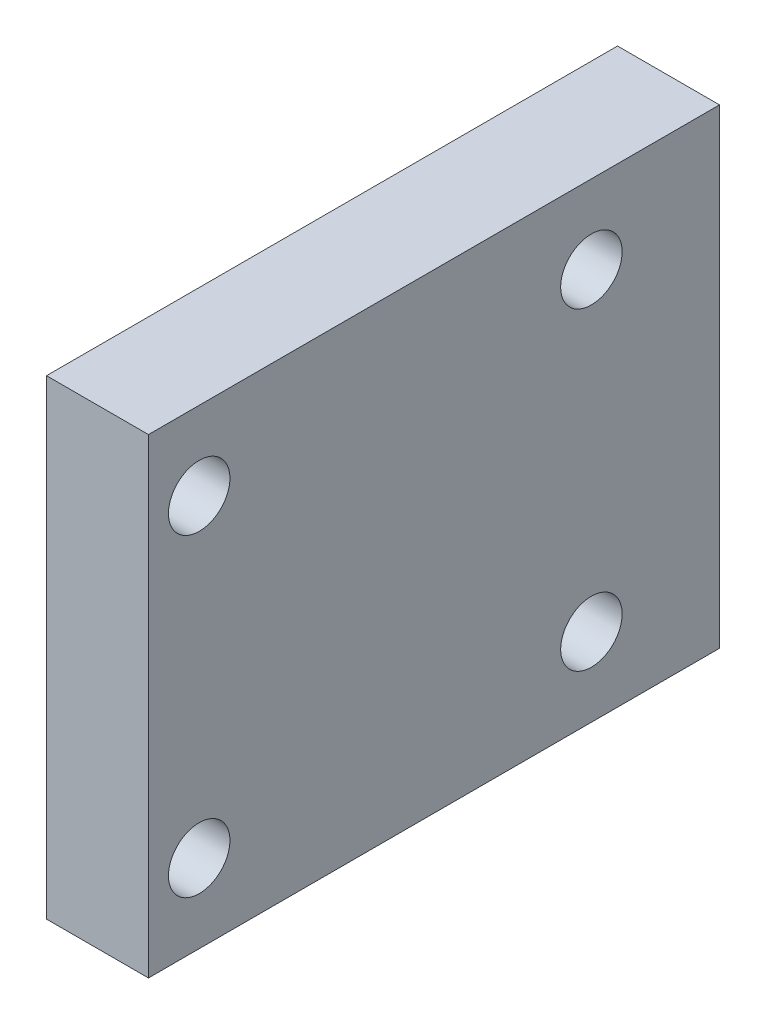
ISO-10303-21;
HEADER;
FILE_DESCRIPTION(('STEP AP214'),'2;1');
FILE_NAME('part.step','',(''),(''),'','','');
FILE_SCHEMA(('AUTOMOTIVE_DESIGN { 1 0 10303 214 1 1 1 1 }'));
ENDSEC;
DATA;
#1=APPLICATION_CONTEXT('core data for automotive mechanical design processes');
#2=APPLICATION_PROTOCOL_DEFINITION('international standard','automotive_design',2000,#1);
#3=PRODUCT_CONTEXT('',#1,'mechanical');
#4=PRODUCT('Part','Part','',(#3));
#5=PRODUCT_RELATED_PRODUCT_CATEGORY('part','',(#4));
#6=PRODUCT_DEFINITION_FORMATION('','',#4);
#7=PRODUCT_DEFINITION_CONTEXT('part definition',#1,'design');
#8=PRODUCT_DEFINITION('design','',#6,#7);
#9=PRODUCT_DEFINITION_SHAPE('','',#8);
#10=(LENGTH_UNIT() NAMED_UNIT(*) SI_UNIT(.MILLI.,.METRE.));
#11=(NAMED_UNIT(*) PLANE_ANGLE_UNIT() SI_UNIT($,.RADIAN.));
#12=(NAMED_UNIT(*) SI_UNIT($,.STERADIAN.) SOLID_ANGLE_UNIT());
#13=UNCERTAINTY_MEASURE_WITH_UNIT(LENGTH_MEASURE(1.E-05),#10,'distance_accuracy_value','');
#14=(GEOMETRIC_REPRESENTATION_CONTEXT(3) GLOBAL_UNCERTAINTY_ASSIGNED_CONTEXT((#13)) GLOBAL_UNIT_ASSIGNED_CONTEXT((#10,
#11,#12)) REPRESENTATION_CONTEXT('',''));
#15=CARTESIAN_POINT('',(0.,0.,0.));
#16=DIRECTION('',(0.,0.,1.));
#17=DIRECTION('',(1.,0.,0.));
#18=AXIS2_PLACEMENT_3D('',#15,#16,#17);
#19=CARTESIAN_POINT('',(-480.710433296048,166.583779805462,-148.759330938672));
#20=DIRECTION('',(0.,0.,-1.));
#21=DIRECTION('',(-1.,0.,0.));
#22=AXIS2_PLACEMENT_3D('',#19,#20,#21);
#23=PLANE('',#22);
#24=DIRECTION('',(0.,-1.,0.));
#25=VECTOR('',#24,1.);
#26=CARTESIAN_POINT('',(-488.965433296048,166.583779805462,-148.759330938672));
#27=LINE('',#26,#25);
#28=CARTESIAN_POINT('',(-488.965433296048,166.583779805462,-148.759330938672));
#29=VERTEX_POINT('',#28);
#30=CARTESIAN_POINT('',(-488.965433296047,128.483779805462,-148.759330938672));
#31=VERTEX_POINT('',#30);
#32=EDGE_CURVE('E102',#29,#31,#27,.T.);
#33=ORIENTED_EDGE('',*,*,#32,.T.);
#34=DIRECTION('',(-1.,0.,0.));
#35=VECTOR('',#34,1.);
#36=CARTESIAN_POINT('',(-480.710433296047,128.483779805462,-148.759330938672));
#37=LINE('',#36,#35);
#38=CARTESIAN_POINT('',(-480.710433296047,128.483779805462,-148.759330938672));
#39=VERTEX_POINT('',#38);
#40=EDGE_CURVE('E11',#39,#31,#37,.T.);
#41=ORIENTED_EDGE('',*,*,#40,.F.);
#42=DIRECTION('',(0.,-1.,0.));
#43=VECTOR('',#42,1.);
#44=CARTESIAN_POINT('',(-480.710433296048,166.583779805462,-148.759330938672));
#45=LINE('',#44,#43);
#46=CARTESIAN_POINT('',(-480.710433296048,166.583779805462,-148.759330938672));
#47=VERTEX_POINT('',#46);
#48=EDGE_CURVE('E89',#47,#39,#45,.T.);
#49=ORIENTED_EDGE('',*,*,#48,.F.);
#50=DIRECTION('',(-1.,0.,0.));
#51=VECTOR('',#50,1.);
#52=CARTESIAN_POINT('',(-480.710433296048,166.583779805462,-148.759330938672));
#53=LINE('',#52,#51);
#54=EDGE_CURVE('E98',#47,#29,#53,.T.);
#55=ORIENTED_EDGE('',*,*,#54,.T.);
#56=EDGE_LOOP('',(#33,#41,#49,#55));
#57=FACE_BOUND('',#56,.T.);
#58=ADVANCED_FACE('F37',(#57),#23,.F.);
#59=CARTESIAN_POINT('',(-480.710433296047,128.483779805462,-194.987330938672));
#60=DIRECTION('',(0.,1.,0.));
#61=DIRECTION('',(-1.,0.,0.));
#62=AXIS2_PLACEMENT_3D('',#59,#60,#61);
#63=PLANE('',#62);
#64=DIRECTION('',(0.,0.,-1.));
#65=VECTOR('',#64,1.);
#66=CARTESIAN_POINT('',(-488.965433296047,128.483779805462,-194.987330938672));
#67=LINE('',#66,#65);
#68=CARTESIAN_POINT('',(-488.965433296047,128.483779805462,-194.987330938672));
#69=VERTEX_POINT('',#68);
#70=EDGE_CURVE('E93',#31,#69,#67,.T.);
#71=ORIENTED_EDGE('',*,*,#70,.T.);
#72=DIRECTION('',(-1.,0.,0.));
#73=VECTOR('',#72,1.);
#74=CARTESIAN_POINT('',(-480.710433296047,128.483779805462,-194.987330938672));
#75=LINE('',#74,#73);
#76=CARTESIAN_POINT('',(-480.710433296047,128.483779805462,-194.987330938672));
#77=VERTEX_POINT('',#76);
#78=EDGE_CURVE('E46',#77,#69,#75,.T.);
#79=ORIENTED_EDGE('',*,*,#78,.F.);
#80=DIRECTION('',(0.,0.,-1.));
#81=VECTOR('',#80,1.);
#82=CARTESIAN_POINT('',(-480.710433296047,128.483779805462,-194.987330938672));
#83=LINE('',#82,#81);
#84=EDGE_CURVE('E84',#39,#77,#83,.T.);
#85=ORIENTED_EDGE('',*,*,#84,.F.);
#86=ORIENTED_EDGE('',*,*,#40,.T.);
#87=EDGE_LOOP('',(#71,#79,#85,#86));
#88=FACE_BOUND('',#87,.T.);
#89=ADVANCED_FACE('F92',(#88),#63,.F.);
#90=CARTESIAN_POINT('',(-480.710433296047,128.483779805462,-194.987330938672));
#91=DIRECTION('',(0.,0.,1.));
#92=DIRECTION('',(1.,0.,0.));
#93=AXIS2_PLACEMENT_3D('',#90,#91,#92);
#94=PLANE('',#93);
#95=DIRECTION('',(0.,1.,0.));
#96=VECTOR('',#95,1.);
#97=CARTESIAN_POINT('',(-488.965433296047,128.483779805462,-194.987330938672));
#98=LINE('',#97,#96);
#99=CARTESIAN_POINT('',(-488.965433296048,166.583779805462,-194.987330938672));
#100=VERTEX_POINT('',#99);
#101=EDGE_CURVE('E71',#69,#100,#98,.T.);
#102=ORIENTED_EDGE('',*,*,#101,.T.);
#103=DIRECTION('',(-1.,0.,0.));
#104=VECTOR('',#103,1.);
#105=CARTESIAN_POINT('',(-480.710433296048,166.583779805462,-194.987330938672));
#106=LINE('',#105,#104);
#107=CARTESIAN_POINT('',(-480.710433296048,166.583779805462,-194.987330938672));
#108=VERTEX_POINT('',#107);
#109=EDGE_CURVE('E94',#108,#100,#106,.T.);
#110=ORIENTED_EDGE('',*,*,#109,.F.);
#111=DIRECTION('',(0.,1.,0.));
#112=VECTOR('',#111,1.);
#113=CARTESIAN_POINT('',(-480.710433296047,128.483779805462,-194.987330938672));
#114=LINE('',#113,#112);
#115=EDGE_CURVE('E87',#77,#108,#114,.T.);
#116=ORIENTED_EDGE('',*,*,#115,.F.);
#117=ORIENTED_EDGE('',*,*,#78,.T.);
#118=EDGE_LOOP('',(#102,#110,#116,#117));
#119=FACE_BOUND('',#118,.T.);
#120=ADVANCED_FACE('F96',(#119),#94,.F.);
#121=CARTESIAN_POINT('',(-480.710433296048,166.583779805462,-194.987330938672));
#122=DIRECTION('',(0.,-1.,0.));
#123=DIRECTION('',(1.,0.,0.));
#124=AXIS2_PLACEMENT_3D('',#121,#122,#123);
#125=PLANE('',#124);
#126=DIRECTION('',(0.,0.,1.));
#127=VECTOR('',#126,1.);
#128=CARTESIAN_POINT('',(-488.965433296048,166.583779805462,-194.987330938672));
#129=LINE('',#128,#127);
#130=EDGE_CURVE('E77',#100,#29,#129,.T.);
#131=ORIENTED_EDGE('',*,*,#130,.T.);
#132=ORIENTED_EDGE('',*,*,#54,.F.);
#133=DIRECTION('',(0.,0.,1.));
#134=VECTOR('',#133,1.);
#135=CARTESIAN_POINT('',(-480.710433296048,166.583779805462,-194.987330938672));
#136=LINE('',#135,#134);
#137=EDGE_CURVE('E54',#108,#47,#136,.T.);
#138=ORIENTED_EDGE('',*,*,#137,.F.);
#139=ORIENTED_EDGE('',*,*,#109,.T.);
#140=EDGE_LOOP('',(#131,#132,#138,#139));
#141=FACE_BOUND('',#140,.T.);
#142=ADVANCED_FACE('F110',(#141),#125,.F.);
#143=CARTESIAN_POINT('',(-480.710433296046,-5.61234270432883E-12,0.));
#144=DIRECTION('',(-1.,0.,0.));
#145=DIRECTION('',(0.,-1.,0.));
#146=AXIS2_PLACEMENT_3D('',#143,#144,#145);
#147=PLANE('',#146);
#148=CARTESIAN_POINT('',(-480.710433296048,160.233779805462,-184.616110940737));
#149=DIRECTION('',(-1.,0.,0.));
#150=DIRECTION('',(0.,-1.,0.));
#151=AXIS2_PLACEMENT_3D('',#148,#149,#150);
#152=CIRCLE('',#151,2.4892);
#153=CARTESIAN_POINT('',(-480.710433296048,157.744579805462,-184.616110940737));
#154=VERTEX_POINT('',#153);
#155=EDGE_CURVE('E40',#154,#154,#152,.T.);
#156=ORIENTED_EDGE('',*,*,#155,.T.);
#157=EDGE_LOOP('',(#156));
#158=FACE_BOUND('',#157,.T.);
#159=CARTESIAN_POINT('',(-480.710433296048,160.233779805462,-152.866110940737));
#160=DIRECTION('',(-1.,0.,0.));
#161=DIRECTION('',(0.,-1.,0.));
#162=AXIS2_PLACEMENT_3D('',#159,#160,#161);
#163=CIRCLE('',#162,2.4892);
#164=CARTESIAN_POINT('',(-480.710433296048,157.744579805462,-152.866110940737));
#165=VERTEX_POINT('',#164);
#166=EDGE_CURVE('E127',#165,#165,#163,.T.);
#167=ORIENTED_EDGE('',*,*,#166,.T.);
#168=EDGE_LOOP('',(#167));
#169=FACE_BOUND('',#168,.T.);
#170=CARTESIAN_POINT('',(-480.710433296048,134.833779805462,-152.866110940737));
#171=DIRECTION('',(-1.,0.,0.));
#172=DIRECTION('',(0.,-1.,0.));
#173=AXIS2_PLACEMENT_3D('',#170,#171,#172);
#174=CIRCLE('',#173,2.4892);
#175=CARTESIAN_POINT('',(-480.710433296047,132.344579805462,-152.866110940737));
#176=VERTEX_POINT('',#175);
#177=EDGE_CURVE('E121',#176,#176,#174,.T.);
#178=ORIENTED_EDGE('',*,*,#177,.T.);
#179=EDGE_LOOP('',(#178));
#180=FACE_BOUND('',#179,.T.);
#181=CARTESIAN_POINT('',(-480.710433296048,134.833779805462,-184.616110940737));
#182=DIRECTION('',(-1.,0.,0.));
#183=DIRECTION('',(0.,-1.,0.));
#184=AXIS2_PLACEMENT_3D('',#181,#182,#183);
#185=CIRCLE('',#184,2.4892);
#186=CARTESIAN_POINT('',(-480.710433296047,132.344579805462,-184.616110940737));
#187=VERTEX_POINT('',#186);
#188=EDGE_CURVE('E105',#187,#187,#185,.T.);
#189=ORIENTED_EDGE('',*,*,#188,.T.);
#190=EDGE_LOOP('',(#189));
#191=FACE_BOUND('',#190,.T.);
#192=ORIENTED_EDGE('',*,*,#48,.T.);
#193=ORIENTED_EDGE('',*,*,#84,.T.);
#194=ORIENTED_EDGE('',*,*,#115,.T.);
#195=ORIENTED_EDGE('',*,*,#137,.T.);
#196=EDGE_LOOP('',(#192,#193,#194,#195));
#197=FACE_BOUND('',#196,.T.);
#198=ADVANCED_FACE('F85',(#158,#169,#180,#191,#197),#147,.F.);
#199=CARTESIAN_POINT('',(-488.965433296046,-5.69932474846285E-12,0.));
#200=DIRECTION('',(-1.,0.,0.));
#201=DIRECTION('',(0.,-1.,0.));
#202=AXIS2_PLACEMENT_3D('',#199,#200,#201);
#203=PLANE('',#202);
#204=CARTESIAN_POINT('',(-488.965433296048,160.233779805462,-184.616110940737));
#205=DIRECTION('',(-1.,0.,0.));
#206=DIRECTION('',(0.,0.,1.));
#207=AXIS2_PLACEMENT_3D('',#204,#205,#206);
#208=CIRCLE('',#207,2.4892);
#209=CARTESIAN_POINT('',(-488.965433296048,160.233779805462,-182.126910940737));
#210=VERTEX_POINT('',#209);
#211=EDGE_CURVE('E133',#210,#210,#208,.T.);
#212=ORIENTED_EDGE('',*,*,#211,.F.);
#213=EDGE_LOOP('',(#212));
#214=FACE_BOUND('',#213,.T.);
#215=CARTESIAN_POINT('',(-488.965433296048,160.233779805462,-152.866110940737));
#216=DIRECTION('',(-1.,0.,0.));
#217=DIRECTION('',(0.,0.,1.));
#218=AXIS2_PLACEMENT_3D('',#215,#216,#217);
#219=CIRCLE('',#218,2.4892);
#220=CARTESIAN_POINT('',(-488.965433296048,160.233779805462,-150.376910940737));
#221=VERTEX_POINT('',#220);
#222=EDGE_CURVE('E130',#221,#221,#219,.T.);
#223=ORIENTED_EDGE('',*,*,#222,.F.);
#224=EDGE_LOOP('',(#223));
#225=FACE_BOUND('',#224,.T.);
#226=CARTESIAN_POINT('',(-488.965433296047,134.833779805462,-152.866110940737));
#227=DIRECTION('',(-1.,0.,0.));
#228=DIRECTION('',(0.,0.,1.));
#229=AXIS2_PLACEMENT_3D('',#226,#227,#228);
#230=CIRCLE('',#229,2.4892);
#231=CARTESIAN_POINT('',(-488.965433296047,134.833779805462,-150.376910940737));
#232=VERTEX_POINT('',#231);
#233=EDGE_CURVE('E124',#232,#232,#230,.T.);
#234=ORIENTED_EDGE('',*,*,#233,.F.);
#235=EDGE_LOOP('',(#234));
#236=FACE_BOUND('',#235,.T.);
#237=CARTESIAN_POINT('',(-488.965433296047,134.833779805462,-184.616110940737));
#238=DIRECTION('',(-1.,0.,0.));
#239=DIRECTION('',(0.,0.,1.));
#240=AXIS2_PLACEMENT_3D('',#237,#238,#239);
#241=CIRCLE('',#240,2.4892);
#242=CARTESIAN_POINT('',(-488.965433296047,134.833779805462,-182.126910940737));
#243=VERTEX_POINT('',#242);
#244=EDGE_CURVE('E118',#243,#243,#241,.T.);
#245=ORIENTED_EDGE('',*,*,#244,.F.);
#246=EDGE_LOOP('',(#245));
#247=FACE_BOUND('',#246,.T.);
#248=ORIENTED_EDGE('',*,*,#32,.F.);
#249=ORIENTED_EDGE('',*,*,#130,.F.);
#250=ORIENTED_EDGE('',*,*,#101,.F.);
#251=ORIENTED_EDGE('',*,*,#70,.F.);
#252=EDGE_LOOP('',(#248,#249,#250,#251));
#253=FACE_BOUND('',#252,.T.);
#254=ADVANCED_FACE('F113',(#214,#225,#236,#247,#253),#203,.T.);
#255=CARTESIAN_POINT('',(-488.965433296047,134.833779805462,-184.616110940737));
#256=DIRECTION('',(-1.,0.,0.));
#257=DIRECTION('',(0.,0.,1.));
#258=AXIS2_PLACEMENT_3D('',#255,#256,#257);
#259=CYLINDRICAL_SURFACE('',#258,2.4892);
#260=ORIENTED_EDGE('',*,*,#244,.T.);
#261=EDGE_LOOP('',(#260));
#262=FACE_BOUND('',#261,.T.);
#263=ORIENTED_EDGE('',*,*,#188,.F.);
#264=EDGE_LOOP('',(#263));
#265=FACE_BOUND('',#264,.T.);
#266=ADVANCED_FACE('F165',(#262,#265),#259,.F.);
#267=CARTESIAN_POINT('',(-488.965433296047,134.833779805462,-152.866110940737));
#268=DIRECTION('',(-1.,0.,0.));
#269=DIRECTION('',(0.,0.,1.));
#270=AXIS2_PLACEMENT_3D('',#267,#268,#269);
#271=CYLINDRICAL_SURFACE('',#270,2.4892);
#272=ORIENTED_EDGE('',*,*,#233,.T.);
#273=EDGE_LOOP('',(#272));
#274=FACE_BOUND('',#273,.T.);
#275=ORIENTED_EDGE('',*,*,#177,.F.);
#276=EDGE_LOOP('',(#275));
#277=FACE_BOUND('',#276,.T.);
#278=ADVANCED_FACE('F149',(#274,#277),#271,.F.);
#279=CARTESIAN_POINT('',(-488.965433296048,160.233779805462,-152.866110940737));
#280=DIRECTION('',(-1.,0.,0.));
#281=DIRECTION('',(0.,0.,1.));
#282=AXIS2_PLACEMENT_3D('',#279,#280,#281);
#283=CYLINDRICAL_SURFACE('',#282,2.4892);
#284=ORIENTED_EDGE('',*,*,#222,.T.);
#285=EDGE_LOOP('',(#284));
#286=FACE_BOUND('',#285,.T.);
#287=ORIENTED_EDGE('',*,*,#166,.F.);
#288=EDGE_LOOP('',(#287));
#289=FACE_BOUND('',#288,.T.);
#290=ADVANCED_FACE('F144',(#286,#289),#283,.F.);
#291=CARTESIAN_POINT('',(-488.965433296048,160.233779805462,-184.616110940737));
#292=DIRECTION('',(-1.,0.,0.));
#293=DIRECTION('',(0.,0.,1.));
#294=AXIS2_PLACEMENT_3D('',#291,#292,#293);
#295=CYLINDRICAL_SURFACE('',#294,2.4892);
#296=ORIENTED_EDGE('',*,*,#211,.T.);
#297=EDGE_LOOP('',(#296));
#298=FACE_BOUND('',#297,.T.);
#299=ORIENTED_EDGE('',*,*,#155,.F.);
#300=EDGE_LOOP('',(#299));
#301=FACE_BOUND('',#300,.T.);
#302=ADVANCED_FACE('F142',(#298,#301),#295,.F.);
#303=CLOSED_SHELL('',(#58,#89,#120,#142,#198,#254,#266,#278,#290,#302));
#304=MANIFOLD_SOLID_BREP('B2',#303);
#305=ADVANCED_BREP_SHAPE_REPRESENTATION('',(#18,#304),#14);
#306=SHAPE_DEFINITION_REPRESENTATION(#9,#305);
ENDSEC;
END-ISO-10303-21;
